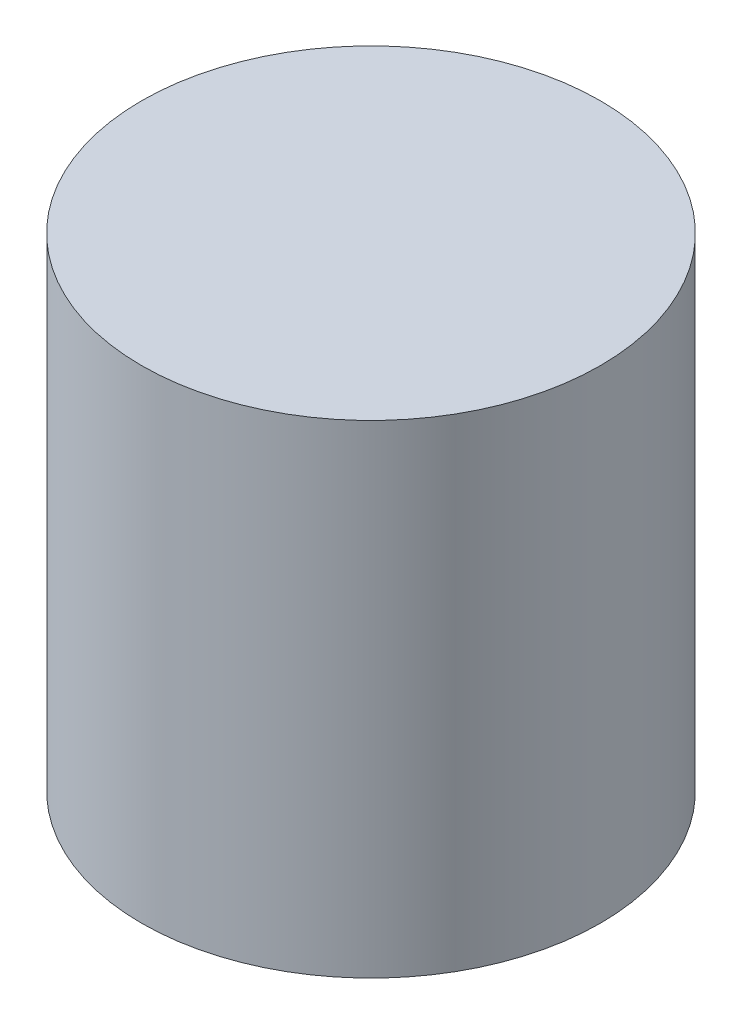
ISO-10303-21;
HEADER;
FILE_DESCRIPTION(('STEP AP214'),'2;1');
FILE_NAME('part.step','',(''),(''),'','','');
FILE_SCHEMA(('AUTOMOTIVE_DESIGN { 1 0 10303 214 1 1 1 1 }'));
ENDSEC;
DATA;
#1=APPLICATION_CONTEXT('core data for automotive mechanical design processes');
#2=APPLICATION_PROTOCOL_DEFINITION('international standard','automotive_design',2000,#1);
#3=PRODUCT_CONTEXT('',#1,'mechanical');
#4=PRODUCT('Part','Part','',(#3));
#5=PRODUCT_RELATED_PRODUCT_CATEGORY('part','',(#4));
#6=PRODUCT_DEFINITION_FORMATION('','',#4);
#7=PRODUCT_DEFINITION_CONTEXT('part definition',#1,'design');
#8=PRODUCT_DEFINITION('design','',#6,#7);
#9=PRODUCT_DEFINITION_SHAPE('','',#8);
#10=(LENGTH_UNIT() NAMED_UNIT(*) SI_UNIT(.MILLI.,.METRE.));
#11=(NAMED_UNIT(*) PLANE_ANGLE_UNIT() SI_UNIT($,.RADIAN.));
#12=(NAMED_UNIT(*) SI_UNIT($,.STERADIAN.) SOLID_ANGLE_UNIT());
#13=UNCERTAINTY_MEASURE_WITH_UNIT(LENGTH_MEASURE(1.E-05),#10,'distance_accuracy_value','');
#14=(GEOMETRIC_REPRESENTATION_CONTEXT(3) GLOBAL_UNCERTAINTY_ASSIGNED_CONTEXT((#13)) GLOBAL_UNIT_ASSIGNED_CONTEXT((#10,
#11,#12)) REPRESENTATION_CONTEXT('',''));
#15=CARTESIAN_POINT('',(0.,0.,0.));
#16=DIRECTION('',(0.,0.,1.));
#17=DIRECTION('',(1.,0.,0.));
#18=AXIS2_PLACEMENT_3D('',#15,#16,#17);
#19=CARTESIAN_POINT('',(0.,63.5,0.));
#20=DIRECTION('',(0.,-1.,0.));
#21=DIRECTION('',(0.,0.,-1.));
#22=AXIS2_PLACEMENT_3D('',#19,#20,#21);
#23=CYLINDRICAL_SURFACE('',#22,30.1625);
#24=CARTESIAN_POINT('',(0.,63.5,0.));
#25=DIRECTION('',(0.,1.,0.));
#26=DIRECTION('',(0.,0.,1.));
#27=AXIS2_PLACEMENT_3D('',#24,#25,#26);
#28=CIRCLE('',#27,30.1625);
#29=CARTESIAN_POINT('',(0.,63.5,30.1625));
#30=VERTEX_POINT('',#29);
#31=EDGE_CURVE('E10',#30,#30,#28,.T.);
#32=ORIENTED_EDGE('',*,*,#31,.F.);
#33=EDGE_LOOP('',(#32));
#34=FACE_BOUND('',#33,.T.);
#35=CARTESIAN_POINT('',(0.,0.,0.));
#36=DIRECTION('',(0.,1.,0.));
#37=DIRECTION('',(0.,0.,1.));
#38=AXIS2_PLACEMENT_3D('',#35,#36,#37);
#39=CIRCLE('',#38,30.1625);
#40=CARTESIAN_POINT('',(0.,0.,30.1625));
#41=VERTEX_POINT('',#40);
#42=EDGE_CURVE('E40',#41,#41,#39,.T.);
#43=ORIENTED_EDGE('',*,*,#42,.T.);
#44=EDGE_LOOP('',(#43));
#45=FACE_BOUND('',#44,.T.);
#46=ADVANCED_FACE('F37',(#34,#45),#23,.T.);
#47=CARTESIAN_POINT('',(0.,63.5,0.));
#48=DIRECTION('',(0.,1.,0.));
#49=DIRECTION('',(0.,0.,1.));
#50=AXIS2_PLACEMENT_3D('',#47,#48,#49);
#51=PLANE('',#50);
#52=ORIENTED_EDGE('',*,*,#31,.T.);
#53=EDGE_LOOP('',(#52));
#54=FACE_BOUND('',#53,.T.);
#55=ADVANCED_FACE('F54',(#54),#51,.T.);
#56=CARTESIAN_POINT('',(0.,0.,0.));
#57=DIRECTION('',(0.,1.,0.));
#58=DIRECTION('',(0.,0.,1.));
#59=AXIS2_PLACEMENT_3D('',#56,#57,#58);
#60=PLANE('',#59);
#61=ORIENTED_EDGE('',*,*,#42,.F.);
#62=EDGE_LOOP('',(#61));
#63=FACE_BOUND('',#62,.T.);
#64=ADVANCED_FACE('F52',(#63),#60,.F.);
#65=CLOSED_SHELL('',(#46,#55,#64));
#66=MANIFOLD_SOLID_BREP('B2',#65);
#67=ADVANCED_BREP_SHAPE_REPRESENTATION('',(#18,#66),#14);
#68=SHAPE_DEFINITION_REPRESENTATION(#9,#67);
ENDSEC;
END-ISO-10303-21;
